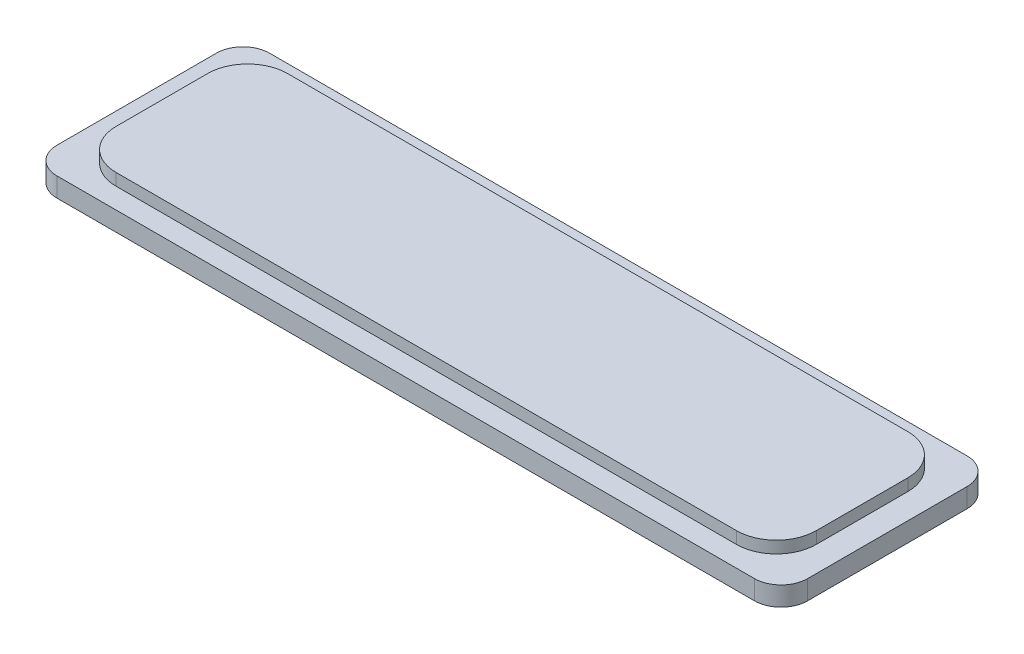
ISO-10303-21;
HEADER;
FILE_DESCRIPTION(('STEP AP214'),'2;1');
FILE_NAME('part.step','',(''),(''),'','','');
FILE_SCHEMA(('AUTOMOTIVE_DESIGN { 1 0 10303 214 1 1 1 1 }'));
ENDSEC;
DATA;
#1=APPLICATION_CONTEXT('core data for automotive mechanical design processes');
#2=APPLICATION_PROTOCOL_DEFINITION('international standard','automotive_design',2000,#1);
#3=PRODUCT_CONTEXT('',#1,'mechanical');
#4=PRODUCT('Part','Part','',(#3));
#5=PRODUCT_RELATED_PRODUCT_CATEGORY('part','',(#4));
#6=PRODUCT_DEFINITION_FORMATION('','',#4);
#7=PRODUCT_DEFINITION_CONTEXT('part definition',#1,'design');
#8=PRODUCT_DEFINITION('design','',#6,#7);
#9=PRODUCT_DEFINITION_SHAPE('','',#8);
#10=(LENGTH_UNIT() NAMED_UNIT(*) SI_UNIT(.MILLI.,.METRE.));
#11=(NAMED_UNIT(*) PLANE_ANGLE_UNIT() SI_UNIT($,.RADIAN.));
#12=(NAMED_UNIT(*) SI_UNIT($,.STERADIAN.) SOLID_ANGLE_UNIT());
#13=UNCERTAINTY_MEASURE_WITH_UNIT(LENGTH_MEASURE(1.E-05),#10,'distance_accuracy_value','');
#14=(GEOMETRIC_REPRESENTATION_CONTEXT(3) GLOBAL_UNCERTAINTY_ASSIGNED_CONTEXT((#13)) GLOBAL_UNIT_ASSIGNED_CONTEXT((#10,
#11,#12)) REPRESENTATION_CONTEXT('',''));
#15=CARTESIAN_POINT('',(0.,0.,0.));
#16=DIRECTION('',(0.,0.,1.));
#17=DIRECTION('',(1.,0.,0.));
#18=AXIS2_PLACEMENT_3D('',#15,#16,#17);
#19=CARTESIAN_POINT('',(26.25,1.45,-6.));
#20=DIRECTION('',(0.,-1.,0.));
#21=DIRECTION('',(0.,0.,-1.));
#22=AXIS2_PLACEMENT_3D('',#19,#20,#21);
#23=PLANE('',#22);
#24=CARTESIAN_POINT('',(26.25,1.45,-6.));
#25=DIRECTION('',(0.,1.,0.));
#26=DIRECTION('',(0.,0.,-1.));
#27=AXIS2_PLACEMENT_3D('',#24,#25,#26);
#28=CIRCLE('',#27,2.);
#29=CARTESIAN_POINT('',(28.25,1.45,-6.));
#30=VERTEX_POINT('',#29);
#31=CARTESIAN_POINT('',(26.25,1.45,-8.));
#32=VERTEX_POINT('',#31);
#33=EDGE_CURVE('E187',#30,#32,#28,.T.);
#34=ORIENTED_EDGE('',*,*,#33,.T.);
#35=DIRECTION('',(-1.,0.,0.));
#36=VECTOR('',#35,1.);
#37=CARTESIAN_POINT('',(-26.25,1.45,-8.));
#38=LINE('',#37,#36);
#39=CARTESIAN_POINT('',(-26.25,1.45,-8.));
#40=VERTEX_POINT('',#39);
#41=EDGE_CURVE('E191',#32,#40,#38,.T.);
#42=ORIENTED_EDGE('',*,*,#41,.T.);
#43=CARTESIAN_POINT('',(-26.25,1.45,-6.));
#44=DIRECTION('',(0.,1.,0.));
#45=DIRECTION('',(0.,0.,-1.));
#46=AXIS2_PLACEMENT_3D('',#43,#44,#45);
#47=CIRCLE('',#46,2.);
#48=CARTESIAN_POINT('',(-28.25,1.45,-6.));
#49=VERTEX_POINT('',#48);
#50=EDGE_CURVE('E195',#40,#49,#47,.T.);
#51=ORIENTED_EDGE('',*,*,#50,.T.);
#52=DIRECTION('',(0.,0.,1.));
#53=VECTOR('',#52,1.);
#54=CARTESIAN_POINT('',(-28.25,1.45,6.));
#55=LINE('',#54,#53);
#56=CARTESIAN_POINT('',(-28.25,1.45,6.));
#57=VERTEX_POINT('',#56);
#58=EDGE_CURVE('E198',#49,#57,#55,.T.);
#59=ORIENTED_EDGE('',*,*,#58,.T.);
#60=CARTESIAN_POINT('',(-26.25,1.45,6.));
#61=DIRECTION('',(0.,1.,0.));
#62=DIRECTION('',(0.,0.,-1.));
#63=AXIS2_PLACEMENT_3D('',#60,#61,#62);
#64=CIRCLE('',#63,2.);
#65=CARTESIAN_POINT('',(-26.25,1.45,8.));
#66=VERTEX_POINT('',#65);
#67=EDGE_CURVE('E201',#57,#66,#64,.T.);
#68=ORIENTED_EDGE('',*,*,#67,.T.);
#69=DIRECTION('',(1.,0.,0.));
#70=VECTOR('',#69,1.);
#71=CARTESIAN_POINT('',(-26.25,1.45,8.));
#72=LINE('',#71,#70);
#73=CARTESIAN_POINT('',(26.25,1.45,8.));
#74=VERTEX_POINT('',#73);
#75=EDGE_CURVE('E204',#66,#74,#72,.T.);
#76=ORIENTED_EDGE('',*,*,#75,.T.);
#77=CARTESIAN_POINT('',(26.25,1.45,6.));
#78=DIRECTION('',(0.,1.,0.));
#79=DIRECTION('',(0.,0.,1.));
#80=AXIS2_PLACEMENT_3D('',#77,#78,#79);
#81=CIRCLE('',#80,2.);
#82=CARTESIAN_POINT('',(28.25,1.45,6.));
#83=VERTEX_POINT('',#82);
#84=EDGE_CURVE('E207',#74,#83,#81,.T.);
#85=ORIENTED_EDGE('',*,*,#84,.T.);
#86=DIRECTION('',(0.,0.,-1.));
#87=VECTOR('',#86,1.);
#88=CARTESIAN_POINT('',(28.25,1.45,6.));
#89=LINE('',#88,#87);
#90=EDGE_CURVE('E210',#83,#30,#89,.T.);
#91=ORIENTED_EDGE('',*,*,#90,.T.);
#92=EDGE_LOOP('',(#34,#42,#51,#59,#68,#76,#85,#91));
#93=FACE_BOUND('',#92,.T.);
#94=CARTESIAN_POINT('',(23.35,1.45,3.45));
#95=DIRECTION('',(0.,1.,0.));
#96=DIRECTION('',(0.,0.,1.));
#97=AXIS2_PLACEMENT_3D('',#94,#95,#96);
#98=CIRCLE('',#97,3.);
#99=CARTESIAN_POINT('',(23.35,1.45,6.45));
#100=VERTEX_POINT('',#99);
#101=CARTESIAN_POINT('',(26.35,1.45,3.44999999999998));
#102=VERTEX_POINT('',#101);
#103=EDGE_CURVE('E55',#100,#102,#98,.T.);
#104=ORIENTED_EDGE('',*,*,#103,.F.);
#105=DIRECTION('',(1.,0.,0.));
#106=VECTOR('',#105,1.);
#107=CARTESIAN_POINT('',(-23.35,1.45,6.45));
#108=LINE('',#107,#106);
#109=CARTESIAN_POINT('',(-23.35,1.45,6.45));
#110=VERTEX_POINT('',#109);
#111=EDGE_CURVE('E59',#110,#100,#108,.T.);
#112=ORIENTED_EDGE('',*,*,#111,.F.);
#113=CARTESIAN_POINT('',(-23.35,1.45,3.45));
#114=DIRECTION('',(0.,1.,0.));
#115=DIRECTION('',(0.,0.,-1.));
#116=AXIS2_PLACEMENT_3D('',#113,#114,#115);
#117=CIRCLE('',#116,3.);
#118=CARTESIAN_POINT('',(-26.35,1.45,3.44999999999998));
#119=VERTEX_POINT('',#118);
#120=EDGE_CURVE('E464',#119,#110,#117,.T.);
#121=ORIENTED_EDGE('',*,*,#120,.F.);
#122=DIRECTION('',(0.,0.,1.));
#123=VECTOR('',#122,1.);
#124=CARTESIAN_POINT('',(-26.35,1.45,3.44999999999998));
#125=LINE('',#124,#123);
#126=CARTESIAN_POINT('',(-26.35,1.45,-3.44999999999998));
#127=VERTEX_POINT('',#126);
#128=EDGE_CURVE('E509',#127,#119,#125,.T.);
#129=ORIENTED_EDGE('',*,*,#128,.F.);
#130=CARTESIAN_POINT('',(-23.35,1.45,-3.45));
#131=DIRECTION('',(0.,1.,0.));
#132=DIRECTION('',(0.,0.,-1.));
#133=AXIS2_PLACEMENT_3D('',#130,#131,#132);
#134=CIRCLE('',#133,3.);
#135=CARTESIAN_POINT('',(-23.35,1.45,-6.45));
#136=VERTEX_POINT('',#135);
#137=EDGE_CURVE('E501',#136,#127,#134,.T.);
#138=ORIENTED_EDGE('',*,*,#137,.F.);
#139=DIRECTION('',(-1.,0.,0.));
#140=VECTOR('',#139,1.);
#141=CARTESIAN_POINT('',(-23.35,1.45,-6.45));
#142=LINE('',#141,#140);
#143=CARTESIAN_POINT('',(23.35,1.45,-6.45));
#144=VERTEX_POINT('',#143);
#145=EDGE_CURVE('E492',#144,#136,#142,.T.);
#146=ORIENTED_EDGE('',*,*,#145,.F.);
#147=CARTESIAN_POINT('',(23.35,1.45,-3.45));
#148=DIRECTION('',(0.,1.,0.));
#149=DIRECTION('',(0.,0.,-1.));
#150=AXIS2_PLACEMENT_3D('',#147,#148,#149);
#151=CIRCLE('',#150,3.);
#152=CARTESIAN_POINT('',(26.35,1.45,-3.44999999999998));
#153=VERTEX_POINT('',#152);
#154=EDGE_CURVE('E495',#153,#144,#151,.T.);
#155=ORIENTED_EDGE('',*,*,#154,.F.);
#156=DIRECTION('',(0.,0.,-1.));
#157=VECTOR('',#156,1.);
#158=CARTESIAN_POINT('',(26.35,1.45,3.44999999999998));
#159=LINE('',#158,#157);
#160=EDGE_CURVE('E497',#102,#153,#159,.T.);
#161=ORIENTED_EDGE('',*,*,#160,.F.);
#162=EDGE_LOOP('',(#104,#112,#121,#129,#138,#146,#155,#161));
#163=FACE_BOUND('',#162,.T.);
#164=ADVANCED_FACE('F39',(#93,#163),#23,.F.);
#165=CARTESIAN_POINT('',(26.25,1.45,-6.));
#166=DIRECTION('',(0.,-1.,0.));
#167=DIRECTION('',(0.,0.,-1.));
#168=AXIS2_PLACEMENT_3D('',#165,#166,#167);
#169=CYLINDRICAL_SURFACE('',#168,2.);
#170=CARTESIAN_POINT('',(26.25,0.,-6.));
#171=DIRECTION('',(0.,1.,0.));
#172=DIRECTION('',(0.,0.,-1.));
#173=AXIS2_PLACEMENT_3D('',#170,#171,#172);
#174=CIRCLE('',#173,2.);
#175=CARTESIAN_POINT('',(28.25,0.,-6.));
#176=VERTEX_POINT('',#175);
#177=CARTESIAN_POINT('',(26.25,0.,-8.));
#178=VERTEX_POINT('',#177);
#179=EDGE_CURVE('E176',#176,#178,#174,.T.);
#180=ORIENTED_EDGE('',*,*,#179,.T.);
#181=DIRECTION('',(0.,-1.,0.));
#182=VECTOR('',#181,1.);
#183=CARTESIAN_POINT('',(26.25,1.45,-8.));
#184=LINE('',#183,#182);
#185=EDGE_CURVE('E11',#32,#178,#184,.T.);
#186=ORIENTED_EDGE('',*,*,#185,.F.);
#187=ORIENTED_EDGE('',*,*,#33,.F.);
#188=DIRECTION('',(0.,-1.,0.));
#189=VECTOR('',#188,1.);
#190=CARTESIAN_POINT('',(28.25,1.45,-6.));
#191=LINE('',#190,#189);
#192=EDGE_CURVE('E212',#30,#176,#191,.T.);
#193=ORIENTED_EDGE('',*,*,#192,.T.);
#194=EDGE_LOOP('',(#180,#186,#187,#193));
#195=FACE_BOUND('',#194,.T.);
#196=ADVANCED_FACE('F41',(#195),#169,.T.);
#197=CARTESIAN_POINT('',(-26.25,1.45,-8.));
#198=DIRECTION('',(0.,0.,1.));
#199=DIRECTION('',(1.,0.,0.));
#200=AXIS2_PLACEMENT_3D('',#197,#198,#199);
#201=PLANE('',#200);
#202=DIRECTION('',(-1.,0.,0.));
#203=VECTOR('',#202,1.);
#204=CARTESIAN_POINT('',(-26.25,0.,-8.));
#205=LINE('',#204,#203);
#206=CARTESIAN_POINT('',(-26.25,0.,-8.));
#207=VERTEX_POINT('',#206);
#208=EDGE_CURVE('E181',#178,#207,#205,.T.);
#209=ORIENTED_EDGE('',*,*,#208,.T.);
#210=DIRECTION('',(0.,-1.,0.));
#211=VECTOR('',#210,1.);
#212=CARTESIAN_POINT('',(-26.25,1.45,-8.));
#213=LINE('',#212,#211);
#214=EDGE_CURVE('E48',#40,#207,#213,.T.);
#215=ORIENTED_EDGE('',*,*,#214,.F.);
#216=ORIENTED_EDGE('',*,*,#41,.F.);
#217=ORIENTED_EDGE('',*,*,#185,.T.);
#218=EDGE_LOOP('',(#209,#215,#216,#217));
#219=FACE_BOUND('',#218,.T.);
#220=ADVANCED_FACE('F283',(#219),#201,.F.);
#221=CARTESIAN_POINT('',(-26.25,1.45,-6.));
#222=DIRECTION('',(0.,-1.,0.));
#223=DIRECTION('',(0.,0.,-1.));
#224=AXIS2_PLACEMENT_3D('',#221,#222,#223);
#225=CYLINDRICAL_SURFACE('',#224,2.);
#226=CARTESIAN_POINT('',(-26.25,0.,-6.));
#227=DIRECTION('',(0.,1.,0.));
#228=DIRECTION('',(0.,0.,-1.));
#229=AXIS2_PLACEMENT_3D('',#226,#227,#228);
#230=CIRCLE('',#229,2.);
#231=CARTESIAN_POINT('',(-28.25,0.,-6.));
#232=VERTEX_POINT('',#231);
#233=EDGE_CURVE('E216',#207,#232,#230,.T.);
#234=ORIENTED_EDGE('',*,*,#233,.T.);
#235=DIRECTION('',(0.,-1.,0.));
#236=VECTOR('',#235,1.);
#237=CARTESIAN_POINT('',(-28.25,1.45,-6.));
#238=LINE('',#237,#236);
#239=EDGE_CURVE('E252',#49,#232,#238,.T.);
#240=ORIENTED_EDGE('',*,*,#239,.F.);
#241=ORIENTED_EDGE('',*,*,#50,.F.);
#242=ORIENTED_EDGE('',*,*,#214,.T.);
#243=EDGE_LOOP('',(#234,#240,#241,#242));
#244=FACE_BOUND('',#243,.T.);
#245=ADVANCED_FACE('F261',(#244),#225,.T.);
#246=CARTESIAN_POINT('',(-28.25,1.45,6.));
#247=DIRECTION('',(1.,0.,0.));
#248=DIRECTION('',(0.,0.,-1.));
#249=AXIS2_PLACEMENT_3D('',#246,#247,#248);
#250=PLANE('',#249);
#251=DIRECTION('',(0.,0.,1.));
#252=VECTOR('',#251,1.);
#253=CARTESIAN_POINT('',(-28.25,0.,6.));
#254=LINE('',#253,#252);
#255=CARTESIAN_POINT('',(-28.25,0.,6.));
#256=VERTEX_POINT('',#255);
#257=EDGE_CURVE('E219',#232,#256,#254,.T.);
#258=ORIENTED_EDGE('',*,*,#257,.T.);
#259=DIRECTION('',(0.,-1.,0.));
#260=VECTOR('',#259,1.);
#261=CARTESIAN_POINT('',(-28.25,1.45,6.));
#262=LINE('',#261,#260);
#263=EDGE_CURVE('E248',#57,#256,#262,.T.);
#264=ORIENTED_EDGE('',*,*,#263,.F.);
#265=ORIENTED_EDGE('',*,*,#58,.F.);
#266=ORIENTED_EDGE('',*,*,#239,.T.);
#267=EDGE_LOOP('',(#258,#264,#265,#266));
#268=FACE_BOUND('',#267,.T.);
#269=ADVANCED_FACE('F272',(#268),#250,.F.);
#270=CARTESIAN_POINT('',(-26.25,1.45,6.));
#271=DIRECTION('',(0.,-1.,0.));
#272=DIRECTION('',(0.,0.,-1.));
#273=AXIS2_PLACEMENT_3D('',#270,#271,#272);
#274=CYLINDRICAL_SURFACE('',#273,2.);
#275=CARTESIAN_POINT('',(-26.25,0.,6.));
#276=DIRECTION('',(0.,1.,0.));
#277=DIRECTION('',(0.,0.,-1.));
#278=AXIS2_PLACEMENT_3D('',#275,#276,#277);
#279=CIRCLE('',#278,2.);
#280=CARTESIAN_POINT('',(-26.25,0.,8.));
#281=VERTEX_POINT('',#280);
#282=EDGE_CURVE('E222',#256,#281,#279,.T.);
#283=ORIENTED_EDGE('',*,*,#282,.T.);
#284=DIRECTION('',(0.,-1.,0.));
#285=VECTOR('',#284,1.);
#286=CARTESIAN_POINT('',(-26.25,1.45,8.));
#287=LINE('',#286,#285);
#288=EDGE_CURVE('E244',#66,#281,#287,.T.);
#289=ORIENTED_EDGE('',*,*,#288,.F.);
#290=ORIENTED_EDGE('',*,*,#67,.F.);
#291=ORIENTED_EDGE('',*,*,#263,.T.);
#292=EDGE_LOOP('',(#283,#289,#290,#291));
#293=FACE_BOUND('',#292,.T.);
#294=ADVANCED_FACE('F276',(#293),#274,.T.);
#295=CARTESIAN_POINT('',(-26.25,1.45,8.));
#296=DIRECTION('',(0.,0.,-1.));
#297=DIRECTION('',(-1.,0.,0.));
#298=AXIS2_PLACEMENT_3D('',#295,#296,#297);
#299=PLANE('',#298);
#300=DIRECTION('',(1.,0.,0.));
#301=VECTOR('',#300,1.);
#302=CARTESIAN_POINT('',(-26.25,0.,8.));
#303=LINE('',#302,#301);
#304=CARTESIAN_POINT('',(26.25,0.,8.));
#305=VERTEX_POINT('',#304);
#306=EDGE_CURVE('E225',#281,#305,#303,.T.);
#307=ORIENTED_EDGE('',*,*,#306,.T.);
#308=DIRECTION('',(0.,-1.,0.));
#309=VECTOR('',#308,1.);
#310=CARTESIAN_POINT('',(26.25,1.45,8.));
#311=LINE('',#310,#309);
#312=EDGE_CURVE('E240',#74,#305,#311,.T.);
#313=ORIENTED_EDGE('',*,*,#312,.F.);
#314=ORIENTED_EDGE('',*,*,#75,.F.);
#315=ORIENTED_EDGE('',*,*,#288,.T.);
#316=EDGE_LOOP('',(#307,#313,#314,#315));
#317=FACE_BOUND('',#316,.T.);
#318=ADVANCED_FACE('F296',(#317),#299,.F.);
#319=CARTESIAN_POINT('',(26.25,1.45,6.));
#320=DIRECTION('',(0.,-1.,0.));
#321=DIRECTION('',(0.,0.,-1.));
#322=AXIS2_PLACEMENT_3D('',#319,#320,#321);
#323=CYLINDRICAL_SURFACE('',#322,2.);
#324=CARTESIAN_POINT('',(26.25,0.,6.));
#325=DIRECTION('',(0.,1.,0.));
#326=DIRECTION('',(0.,0.,1.));
#327=AXIS2_PLACEMENT_3D('',#324,#325,#326);
#328=CIRCLE('',#327,2.);
#329=CARTESIAN_POINT('',(28.25,0.,6.));
#330=VERTEX_POINT('',#329);
#331=EDGE_CURVE('E228',#305,#330,#328,.T.);
#332=ORIENTED_EDGE('',*,*,#331,.T.);
#333=DIRECTION('',(0.,-1.,0.));
#334=VECTOR('',#333,1.);
#335=CARTESIAN_POINT('',(28.25,1.45,6.));
#336=LINE('',#335,#334);
#337=EDGE_CURVE('E236',#83,#330,#336,.T.);
#338=ORIENTED_EDGE('',*,*,#337,.F.);
#339=ORIENTED_EDGE('',*,*,#84,.F.);
#340=ORIENTED_EDGE('',*,*,#312,.T.);
#341=EDGE_LOOP('',(#332,#338,#339,#340));
#342=FACE_BOUND('',#341,.T.);
#343=ADVANCED_FACE('F294',(#342),#323,.T.);
#344=CARTESIAN_POINT('',(28.25,1.45,6.));
#345=DIRECTION('',(-1.,0.,0.));
#346=DIRECTION('',(0.,0.,1.));
#347=AXIS2_PLACEMENT_3D('',#344,#345,#346);
#348=PLANE('',#347);
#349=DIRECTION('',(0.,0.,-1.));
#350=VECTOR('',#349,1.);
#351=CARTESIAN_POINT('',(28.25,0.,6.));
#352=LINE('',#351,#350);
#353=EDGE_CURVE('E192',#330,#176,#352,.T.);
#354=ORIENTED_EDGE('',*,*,#353,.T.);
#355=ORIENTED_EDGE('',*,*,#192,.F.);
#356=ORIENTED_EDGE('',*,*,#90,.F.);
#357=ORIENTED_EDGE('',*,*,#337,.T.);
#358=EDGE_LOOP('',(#354,#355,#356,#357));
#359=FACE_BOUND('',#358,.T.);
#360=ADVANCED_FACE('F289',(#359),#348,.F.);
#361=CARTESIAN_POINT('',(26.25,0.,-6.));
#362=DIRECTION('',(0.,-1.,0.));
#363=DIRECTION('',(0.,0.,-1.));
#364=AXIS2_PLACEMENT_3D('',#361,#362,#363);
#365=PLANE('',#364);
#366=ORIENTED_EDGE('',*,*,#179,.F.);
#367=ORIENTED_EDGE('',*,*,#353,.F.);
#368=ORIENTED_EDGE('',*,*,#331,.F.);
#369=ORIENTED_EDGE('',*,*,#306,.F.);
#370=ORIENTED_EDGE('',*,*,#282,.F.);
#371=ORIENTED_EDGE('',*,*,#257,.F.);
#372=ORIENTED_EDGE('',*,*,#233,.F.);
#373=ORIENTED_EDGE('',*,*,#208,.F.);
#374=EDGE_LOOP('',(#366,#367,#368,#369,#370,#371,#372,#373));
#375=FACE_BOUND('',#374,.T.);
#376=ADVANCED_FACE('F267',(#375),#365,.T.);
#377=CARTESIAN_POINT('',(23.35,2.35,3.45));
#378=DIRECTION('',(0.,-1.,0.));
#379=DIRECTION('',(0.,0.,-1.));
#380=AXIS2_PLACEMENT_3D('',#377,#378,#379);
#381=CYLINDRICAL_SURFACE('',#380,3.);
#382=ORIENTED_EDGE('',*,*,#103,.T.);
#383=DIRECTION('',(0.,-1.,0.));
#384=VECTOR('',#383,1.);
#385=CARTESIAN_POINT('',(26.35,2.35,3.44999999999998));
#386=LINE('',#385,#384);
#387=CARTESIAN_POINT('',(26.35,2.35,3.44999999999998));
#388=VERTEX_POINT('',#387);
#389=EDGE_CURVE('E156',#388,#102,#386,.T.);
#390=ORIENTED_EDGE('',*,*,#389,.F.);
#391=CARTESIAN_POINT('',(23.35,2.35,3.45));
#392=DIRECTION('',(0.,1.,0.));
#393=DIRECTION('',(0.,0.,1.));
#394=AXIS2_PLACEMENT_3D('',#391,#392,#393);
#395=CIRCLE('',#394,3.);
#396=CARTESIAN_POINT('',(23.35,2.35,6.45));
#397=VERTEX_POINT('',#396);
#398=EDGE_CURVE('E163',#397,#388,#395,.T.);
#399=ORIENTED_EDGE('',*,*,#398,.F.);
#400=DIRECTION('',(0.,-1.,0.));
#401=VECTOR('',#400,1.);
#402=CARTESIAN_POINT('',(23.35,2.35,6.45));
#403=LINE('',#402,#401);
#404=EDGE_CURVE('E460',#397,#100,#403,.T.);
#405=ORIENTED_EDGE('',*,*,#404,.T.);
#406=EDGE_LOOP('',(#382,#390,#399,#405));
#407=FACE_BOUND('',#406,.T.);
#408=ADVANCED_FACE('F174',(#407),#381,.T.);
#409=CARTESIAN_POINT('',(26.35,2.35,3.44999999999998));
#410=DIRECTION('',(-1.,0.,0.));
#411=DIRECTION('',(0.,0.,1.));
#412=AXIS2_PLACEMENT_3D('',#409,#410,#411);
#413=PLANE('',#412);
#414=ORIENTED_EDGE('',*,*,#160,.T.);
#415=DIRECTION('',(0.,-1.,0.));
#416=VECTOR('',#415,1.);
#417=CARTESIAN_POINT('',(26.35,2.35,-3.44999999999998));
#418=LINE('',#417,#416);
#419=CARTESIAN_POINT('',(26.35,2.35,-3.44999999999998));
#420=VERTEX_POINT('',#419);
#421=EDGE_CURVE('E158',#420,#153,#418,.T.);
#422=ORIENTED_EDGE('',*,*,#421,.F.);
#423=DIRECTION('',(0.,0.,-1.));
#424=VECTOR('',#423,1.);
#425=CARTESIAN_POINT('',(26.35,2.35,3.44999999999998));
#426=LINE('',#425,#424);
#427=EDGE_CURVE('E151',#388,#420,#426,.T.);
#428=ORIENTED_EDGE('',*,*,#427,.F.);
#429=ORIENTED_EDGE('',*,*,#389,.T.);
#430=EDGE_LOOP('',(#414,#422,#428,#429));
#431=FACE_BOUND('',#430,.T.);
#432=ADVANCED_FACE('F154',(#431),#413,.F.);
#433=CARTESIAN_POINT('',(23.35,2.35,-3.45));
#434=DIRECTION('',(0.,-1.,0.));
#435=DIRECTION('',(0.,0.,-1.));
#436=AXIS2_PLACEMENT_3D('',#433,#434,#435);
#437=CYLINDRICAL_SURFACE('',#436,3.);
#438=ORIENTED_EDGE('',*,*,#154,.T.);
#439=DIRECTION('',(0.,-1.,0.));
#440=VECTOR('',#439,1.);
#441=CARTESIAN_POINT('',(23.35,2.35,-6.45));
#442=LINE('',#441,#440);
#443=CARTESIAN_POINT('',(23.35,2.35,-6.45));
#444=VERTEX_POINT('',#443);
#445=EDGE_CURVE('E183',#444,#144,#442,.T.);
#446=ORIENTED_EDGE('',*,*,#445,.F.);
#447=CARTESIAN_POINT('',(23.35,2.35,-3.45));
#448=DIRECTION('',(0.,1.,0.));
#449=DIRECTION('',(0.,0.,-1.));
#450=AXIS2_PLACEMENT_3D('',#447,#448,#449);
#451=CIRCLE('',#450,3.);
#452=EDGE_CURVE('E162',#420,#444,#451,.T.);
#453=ORIENTED_EDGE('',*,*,#452,.F.);
#454=ORIENTED_EDGE('',*,*,#421,.T.);
#455=EDGE_LOOP('',(#438,#446,#453,#454));
#456=FACE_BOUND('',#455,.T.);
#457=ADVANCED_FACE('F335',(#456),#437,.T.);
#458=CARTESIAN_POINT('',(-23.35,2.35,-6.45));
#459=DIRECTION('',(0.,0.,1.));
#460=DIRECTION('',(1.,0.,0.));
#461=AXIS2_PLACEMENT_3D('',#458,#459,#460);
#462=PLANE('',#461);
#463=ORIENTED_EDGE('',*,*,#145,.T.);
#464=DIRECTION('',(0.,-1.,0.));
#465=VECTOR('',#464,1.);
#466=CARTESIAN_POINT('',(-23.35,2.35,-6.45));
#467=LINE('',#466,#465);
#468=CARTESIAN_POINT('',(-23.35,2.35,-6.45));
#469=VERTEX_POINT('',#468);
#470=EDGE_CURVE('E483',#469,#136,#467,.T.);
#471=ORIENTED_EDGE('',*,*,#470,.F.);
#472=DIRECTION('',(-1.,0.,0.));
#473=VECTOR('',#472,1.);
#474=CARTESIAN_POINT('',(-23.35,2.35,-6.45));
#475=LINE('',#474,#473);
#476=EDGE_CURVE('E493',#444,#469,#475,.T.);
#477=ORIENTED_EDGE('',*,*,#476,.F.);
#478=ORIENTED_EDGE('',*,*,#445,.T.);
#479=EDGE_LOOP('',(#463,#471,#477,#478));
#480=FACE_BOUND('',#479,.T.);
#481=ADVANCED_FACE('F341',(#480),#462,.F.);
#482=CARTESIAN_POINT('',(-23.35,2.35,-3.45));
#483=DIRECTION('',(0.,-1.,0.));
#484=DIRECTION('',(0.,0.,-1.));
#485=AXIS2_PLACEMENT_3D('',#482,#483,#484);
#486=CYLINDRICAL_SURFACE('',#485,3.);
#487=ORIENTED_EDGE('',*,*,#137,.T.);
#488=DIRECTION('',(0.,-1.,0.));
#489=VECTOR('',#488,1.);
#490=CARTESIAN_POINT('',(-26.35,2.35,-3.44999999999998));
#491=LINE('',#490,#489);
#492=CARTESIAN_POINT('',(-26.35,2.35,-3.44999999999998));
#493=VERTEX_POINT('',#492);
#494=EDGE_CURVE('E479',#493,#127,#491,.T.);
#495=ORIENTED_EDGE('',*,*,#494,.F.);
#496=CARTESIAN_POINT('',(-23.35,2.35,-3.45));
#497=DIRECTION('',(0.,1.,0.));
#498=DIRECTION('',(0.,0.,-1.));
#499=AXIS2_PLACEMENT_3D('',#496,#497,#498);
#500=CIRCLE('',#499,3.);
#501=EDGE_CURVE('E519',#469,#493,#500,.T.);
#502=ORIENTED_EDGE('',*,*,#501,.F.);
#503=ORIENTED_EDGE('',*,*,#470,.T.);
#504=EDGE_LOOP('',(#487,#495,#502,#503));
#505=FACE_BOUND('',#504,.T.);
#506=ADVANCED_FACE('F349',(#505),#486,.T.);
#507=CARTESIAN_POINT('',(-26.35,2.35,3.44999999999998));
#508=DIRECTION('',(1.,0.,0.));
#509=DIRECTION('',(0.,0.,-1.));
#510=AXIS2_PLACEMENT_3D('',#507,#508,#509);
#511=PLANE('',#510);
#512=ORIENTED_EDGE('',*,*,#128,.T.);
#513=DIRECTION('',(0.,-1.,0.));
#514=VECTOR('',#513,1.);
#515=CARTESIAN_POINT('',(-26.35,2.35,3.44999999999998));
#516=LINE('',#515,#514);
#517=CARTESIAN_POINT('',(-26.35,2.35,3.44999999999998));
#518=VERTEX_POINT('',#517);
#519=EDGE_CURVE('E470',#518,#119,#516,.T.);
#520=ORIENTED_EDGE('',*,*,#519,.F.);
#521=DIRECTION('',(0.,0.,1.));
#522=VECTOR('',#521,1.);
#523=CARTESIAN_POINT('',(-26.35,2.35,3.44999999999998));
#524=LINE('',#523,#522);
#525=EDGE_CURVE('E517',#493,#518,#524,.T.);
#526=ORIENTED_EDGE('',*,*,#525,.F.);
#527=ORIENTED_EDGE('',*,*,#494,.T.);
#528=EDGE_LOOP('',(#512,#520,#526,#527));
#529=FACE_BOUND('',#528,.T.);
#530=ADVANCED_FACE('F357',(#529),#511,.F.);
#531=CARTESIAN_POINT('',(-23.35,2.35,3.45));
#532=DIRECTION('',(0.,-1.,0.));
#533=DIRECTION('',(0.,0.,-1.));
#534=AXIS2_PLACEMENT_3D('',#531,#532,#533);
#535=CYLINDRICAL_SURFACE('',#534,3.);
#536=ORIENTED_EDGE('',*,*,#120,.T.);
#537=DIRECTION('',(0.,-1.,0.));
#538=VECTOR('',#537,1.);
#539=CARTESIAN_POINT('',(-23.35,2.35,6.45));
#540=LINE('',#539,#538);
#541=CARTESIAN_POINT('',(-23.35,2.35,6.45));
#542=VERTEX_POINT('',#541);
#543=EDGE_CURVE('E462',#542,#110,#540,.T.);
#544=ORIENTED_EDGE('',*,*,#543,.F.);
#545=CARTESIAN_POINT('',(-23.35,2.35,3.45));
#546=DIRECTION('',(0.,1.,0.));
#547=DIRECTION('',(0.,0.,-1.));
#548=AXIS2_PLACEMENT_3D('',#545,#546,#547);
#549=CIRCLE('',#548,3.);
#550=EDGE_CURVE('E472',#518,#542,#549,.T.);
#551=ORIENTED_EDGE('',*,*,#550,.F.);
#552=ORIENTED_EDGE('',*,*,#519,.T.);
#553=EDGE_LOOP('',(#536,#544,#551,#552));
#554=FACE_BOUND('',#553,.T.);
#555=ADVANCED_FACE('F365',(#554),#535,.T.);
#556=CARTESIAN_POINT('',(-23.35,2.35,6.45));
#557=DIRECTION('',(0.,0.,-1.));
#558=DIRECTION('',(-1.,0.,0.));
#559=AXIS2_PLACEMENT_3D('',#556,#557,#558);
#560=PLANE('',#559);
#561=ORIENTED_EDGE('',*,*,#111,.T.);
#562=ORIENTED_EDGE('',*,*,#404,.F.);
#563=DIRECTION('',(1.,0.,0.));
#564=VECTOR('',#563,1.);
#565=CARTESIAN_POINT('',(-23.35,2.35,6.45));
#566=LINE('',#565,#564);
#567=EDGE_CURVE('E168',#542,#397,#566,.T.);
#568=ORIENTED_EDGE('',*,*,#567,.F.);
#569=ORIENTED_EDGE('',*,*,#543,.T.);
#570=EDGE_LOOP('',(#561,#562,#568,#569));
#571=FACE_BOUND('',#570,.T.);
#572=ADVANCED_FACE('F373',(#571),#560,.F.);
#573=CARTESIAN_POINT('',(23.35,2.35,3.45));
#574=DIRECTION('',(0.,1.,0.));
#575=DIRECTION('',(0.,0.,1.));
#576=AXIS2_PLACEMENT_3D('',#573,#574,#575);
#577=PLANE('',#576);
#578=ORIENTED_EDGE('',*,*,#398,.T.);
#579=ORIENTED_EDGE('',*,*,#427,.T.);
#580=ORIENTED_EDGE('',*,*,#452,.T.);
#581=ORIENTED_EDGE('',*,*,#476,.T.);
#582=ORIENTED_EDGE('',*,*,#501,.T.);
#583=ORIENTED_EDGE('',*,*,#525,.T.);
#584=ORIENTED_EDGE('',*,*,#550,.T.);
#585=ORIENTED_EDGE('',*,*,#567,.T.);
#586=EDGE_LOOP('',(#578,#579,#580,#581,#582,#583,#584,#585));
#587=FACE_BOUND('',#586,.T.);
#588=ADVANCED_FACE('F166',(#587),#577,.T.);
#589=CLOSED_SHELL('',(#164,#196,#220,#245,#269,#294,#318,#343,#360,#376,#408,#432,#457,#481,
#506,#530,#555,#572,#588));
#590=MANIFOLD_SOLID_BREP('B2',#589);
#591=ADVANCED_BREP_SHAPE_REPRESENTATION('',(#18,#590),#14);
#592=SHAPE_DEFINITION_REPRESENTATION(#9,#591);
ENDSEC;
END-ISO-10303-21;
